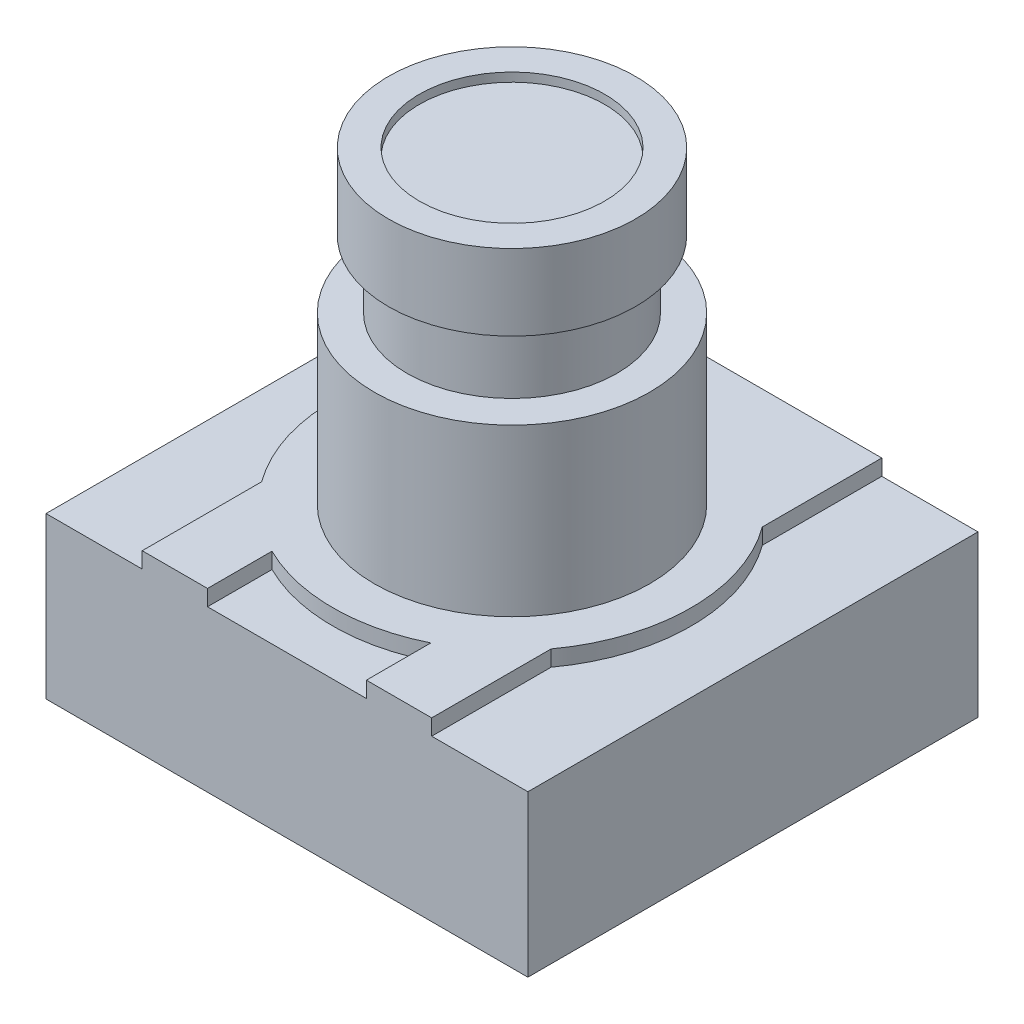
ISO-10303-21;
HEADER;
FILE_DESCRIPTION(('STEP AP214'),'2;1');
FILE_NAME('part.step','',(''),(''),'','','');
FILE_SCHEMA(('AUTOMOTIVE_DESIGN { 1 0 10303 214 1 1 1 1 }'));
ENDSEC;
DATA;
#1=APPLICATION_CONTEXT('core data for automotive mechanical design processes');
#2=APPLICATION_PROTOCOL_DEFINITION('international standard','automotive_design',2000,#1);
#3=PRODUCT_CONTEXT('',#1,'mechanical');
#4=PRODUCT('Part','Part','',(#3));
#5=PRODUCT_RELATED_PRODUCT_CATEGORY('part','',(#4));
#6=PRODUCT_DEFINITION_FORMATION('','',#4);
#7=PRODUCT_DEFINITION_CONTEXT('part definition',#1,'design');
#8=PRODUCT_DEFINITION('design','',#6,#7);
#9=PRODUCT_DEFINITION_SHAPE('','',#8);
#10=(LENGTH_UNIT() NAMED_UNIT(*) SI_UNIT(.MILLI.,.METRE.));
#11=(NAMED_UNIT(*) PLANE_ANGLE_UNIT() SI_UNIT($,.RADIAN.));
#12=(NAMED_UNIT(*) SI_UNIT($,.STERADIAN.) SOLID_ANGLE_UNIT());
#13=UNCERTAINTY_MEASURE_WITH_UNIT(LENGTH_MEASURE(1.E-05),#10,'distance_accuracy_value','');
#14=(GEOMETRIC_REPRESENTATION_CONTEXT(3) GLOBAL_UNCERTAINTY_ASSIGNED_CONTEXT((#13)) GLOBAL_UNIT_ASSIGNED_CONTEXT((#10,
#11,#12)) REPRESENTATION_CONTEXT('',''));
#15=CARTESIAN_POINT('',(0.,0.,0.));
#16=DIRECTION('',(0.,0.,1.));
#17=DIRECTION('',(1.,0.,0.));
#18=AXIS2_PLACEMENT_3D('',#15,#16,#17);
#19=CARTESIAN_POINT('',(-3.45,-1.1,8.05));
#20=DIRECTION('',(0.,0.,1.));
#21=DIRECTION('',(1.,0.,0.));
#22=AXIS2_PLACEMENT_3D('',#19,#20,#21);
#23=PLANE('',#22);
#24=DIRECTION('',(1.,0.,0.));
#25=VECTOR('',#24,1.);
#26=CARTESIAN_POINT('',(-3.45,0.,8.05));
#27=LINE('',#26,#25);
#28=CARTESIAN_POINT('',(-3.45,0.,8.05));
#29=VERTEX_POINT('',#28);
#30=CARTESIAN_POINT('',(-2.95,0.,8.05));
#31=VERTEX_POINT('',#30);
#32=EDGE_CURVE('E252',#29,#31,#27,.T.);
#33=ORIENTED_EDGE('',*,*,#32,.T.);
#34=DIRECTION('',(0.,-1.,0.));
#35=VECTOR('',#34,1.);
#36=CARTESIAN_POINT('',(-2.95,1.4,8.05));
#37=LINE('',#36,#35);
#38=CARTESIAN_POINT('',(-2.95,-1.1,8.05));
#39=VERTEX_POINT('',#38);
#40=EDGE_CURVE('E213',#31,#39,#37,.T.);
#41=ORIENTED_EDGE('',*,*,#40,.T.);
#42=DIRECTION('',(1.,0.,0.));
#43=VECTOR('',#42,1.);
#44=CARTESIAN_POINT('',(-3.45,-1.1,8.05));
#45=LINE('',#44,#43);
#46=CARTESIAN_POINT('',(-3.45,-1.1,8.05));
#47=VERTEX_POINT('',#46);
#48=EDGE_CURVE('E257',#47,#39,#45,.T.);
#49=ORIENTED_EDGE('',*,*,#48,.F.);
#50=DIRECTION('',(0.,1.,0.));
#51=VECTOR('',#50,1.);
#52=CARTESIAN_POINT('',(-3.45,-1.1,8.05));
#53=LINE('',#52,#51);
#54=EDGE_CURVE('E272',#47,#29,#53,.T.);
#55=ORIENTED_EDGE('',*,*,#54,.T.);
#56=EDGE_LOOP('',(#33,#41,#49,#55));
#57=FACE_BOUND('',#56,.T.);
#58=ADVANCED_FACE('F37',(#57),#23,.F.);
#59=CARTESIAN_POINT('',(0.,0.,0.));
#60=DIRECTION('',(0.,1.,0.));
#61=DIRECTION('',(0.,0.,1.));
#62=AXIS2_PLACEMENT_3D('',#59,#60,#61);
#63=PLANE('',#62);
#64=DIRECTION('',(0.,0.,-1.));
#65=VECTOR('',#64,1.);
#66=CARTESIAN_POINT('',(13.65,0.,-12.75));
#67=LINE('',#66,#65);
#68=CARTESIAN_POINT('',(13.65,0.,12.75));
#69=VERTEX_POINT('',#68);
#70=CARTESIAN_POINT('',(13.65,0.,-12.75));
#71=VERTEX_POINT('',#70);
#72=EDGE_CURVE('E382',#69,#71,#67,.T.);
#73=ORIENTED_EDGE('',*,*,#72,.F.);
#74=DIRECTION('',(1.,0.,0.));
#75=VECTOR('',#74,1.);
#76=CARTESIAN_POINT('',(-13.65,0.,12.75));
#77=LINE('',#76,#75);
#78=CARTESIAN_POINT('',(-13.65,0.,12.75));
#79=VERTEX_POINT('',#78);
#80=EDGE_CURVE('E394',#79,#69,#77,.T.);
#81=ORIENTED_EDGE('',*,*,#80,.F.);
#82=DIRECTION('',(0.,0.,1.));
#83=VECTOR('',#82,1.);
#84=CARTESIAN_POINT('',(-13.65,0.,-12.75));
#85=LINE('',#84,#83);
#86=CARTESIAN_POINT('',(-13.65,0.,-12.75));
#87=VERTEX_POINT('',#86);
#88=EDGE_CURVE('E404',#87,#79,#85,.T.);
#89=ORIENTED_EDGE('',*,*,#88,.F.);
#90=DIRECTION('',(-1.,0.,0.));
#91=VECTOR('',#90,1.);
#92=CARTESIAN_POINT('',(-13.65,0.,-12.75));
#93=LINE('',#92,#91);
#94=EDGE_CURVE('E401',#71,#87,#93,.T.);
#95=ORIENTED_EDGE('',*,*,#94,.F.);
#96=EDGE_LOOP('',(#73,#81,#89,#95));
#97=FACE_BOUND('',#96,.T.);
#98=DIRECTION('',(0.,0.,1.));
#99=VECTOR('',#98,1.);
#100=CARTESIAN_POINT('',(3.45,0.,11.25));
#101=LINE('',#100,#99);
#102=CARTESIAN_POINT('',(3.45,0.,8.05));
#103=VERTEX_POINT('',#102);
#104=CARTESIAN_POINT('',(3.45,0.,11.25));
#105=VERTEX_POINT('',#104);
#106=EDGE_CURVE('E247',#103,#105,#101,.T.);
#107=ORIENTED_EDGE('',*,*,#106,.F.);
#108=CARTESIAN_POINT('',(2.95,0.,8.05));
#109=VERTEX_POINT('',#108);
#110=EDGE_CURVE('E267',#109,#103,#27,.T.);
#111=ORIENTED_EDGE('',*,*,#110,.F.);
#112=DIRECTION('',(-1.,0.,0.));
#113=VECTOR('',#112,1.);
#114=CARTESIAN_POINT('',(0.,0.,8.05));
#115=LINE('',#114,#113);
#116=EDGE_CURVE('E242',#109,#31,#115,.T.);
#117=ORIENTED_EDGE('',*,*,#116,.T.);
#118=ORIENTED_EDGE('',*,*,#32,.F.);
#119=DIRECTION('',(0.,0.,-1.));
#120=VECTOR('',#119,1.);
#121=CARTESIAN_POINT('',(-3.45,0.,11.25));
#122=LINE('',#121,#120);
#123=CARTESIAN_POINT('',(-3.45,0.,11.25));
#124=VERTEX_POINT('',#123);
#125=EDGE_CURVE('E264',#124,#29,#122,.T.);
#126=ORIENTED_EDGE('',*,*,#125,.F.);
#127=DIRECTION('',(-1.,0.,0.));
#128=VECTOR('',#127,1.);
#129=CARTESIAN_POINT('',(-3.45,0.,11.25));
#130=LINE('',#129,#128);
#131=EDGE_CURVE('E60',#105,#124,#130,.T.);
#132=ORIENTED_EDGE('',*,*,#131,.F.);
#133=EDGE_LOOP('',(#107,#111,#117,#118,#126,#132));
#134=FACE_BOUND('',#133,.T.);
#135=ADVANCED_FACE('F427',(#97,#134),#63,.F.);
#136=CARTESIAN_POINT('',(0.,19.4,0.));
#137=DIRECTION('',(0.,1.,0.));
#138=DIRECTION('',(0.,0.,1.));
#139=AXIS2_PLACEMENT_3D('',#136,#137,#138);
#140=PLANE('',#139);
#141=CARTESIAN_POINT('',(0.,19.4,0.));
#142=DIRECTION('',(0.,1.,0.));
#143=DIRECTION('',(0.,0.,1.));
#144=AXIS2_PLACEMENT_3D('',#141,#142,#143);
#145=CIRCLE('',#144,7.8);
#146=CARTESIAN_POINT('',(0.,19.4,7.8));
#147=VERTEX_POINT('',#146);
#148=EDGE_CURVE('E299',#147,#147,#145,.T.);
#149=ORIENTED_EDGE('',*,*,#148,.T.);
#150=EDGE_LOOP('',(#149));
#151=FACE_BOUND('',#150,.T.);
#152=CARTESIAN_POINT('',(0.,19.4,0.));
#153=DIRECTION('',(0.,1.,0.));
#154=DIRECTION('',(0.,0.,1.));
#155=AXIS2_PLACEMENT_3D('',#152,#153,#154);
#156=CIRCLE('',#155,5.95);
#157=CARTESIAN_POINT('',(0.,19.4,-5.95));
#158=VERTEX_POINT('',#157);
#159=EDGE_CURVE('E292',#158,#158,#156,.T.);
#160=ORIENTED_EDGE('',*,*,#159,.F.);
#161=EDGE_LOOP('',(#160));
#162=FACE_BOUND('',#161,.T.);
#163=ADVANCED_FACE('F502',(#151,#162),#140,.T.);
#164=CARTESIAN_POINT('',(0.,10.,0.));
#165=DIRECTION('',(0.,1.,0.));
#166=DIRECTION('',(0.,0.,1.));
#167=AXIS2_PLACEMENT_3D('',#164,#165,#166);
#168=PLANE('',#167);
#169=DIRECTION('',(0.,0.,1.));
#170=VECTOR('',#169,1.);
#171=CARTESIAN_POINT('',(-4.5,10.,0.));
#172=LINE('',#171,#170);
#173=CARTESIAN_POINT('',(-4.5,10.,9.09793932712238));
#174=VERTEX_POINT('',#173);
#175=CARTESIAN_POINT('',(-4.5,10.,12.75));
#176=VERTEX_POINT('',#175);
#177=EDGE_CURVE('E309',#174,#176,#172,.T.);
#178=ORIENTED_EDGE('',*,*,#177,.F.);
#179=CARTESIAN_POINT('',(0.,10.,0.));
#180=DIRECTION('',(0.,1.,0.));
#181=DIRECTION('',(0.,0.,1.));
#182=AXIS2_PLACEMENT_3D('',#179,#180,#181);
#183=CIRCLE('',#182,10.15);
#184=CARTESIAN_POINT('',(4.49999999999999,10.,9.09793932712238));
#185=VERTEX_POINT('',#184);
#186=EDGE_CURVE('E319',#174,#185,#183,.T.);
#187=ORIENTED_EDGE('',*,*,#186,.T.);
#188=DIRECTION('',(0.,0.,1.));
#189=VECTOR('',#188,1.);
#190=CARTESIAN_POINT('',(4.5,10.,0.));
#191=LINE('',#190,#189);
#192=CARTESIAN_POINT('',(4.49999999999998,10.,12.75));
#193=VERTEX_POINT('',#192);
#194=EDGE_CURVE('E302',#185,#193,#191,.T.);
#195=ORIENTED_EDGE('',*,*,#194,.T.);
#196=DIRECTION('',(1.,0.,0.));
#197=VECTOR('',#196,1.);
#198=CARTESIAN_POINT('',(-13.65,10.,12.75));
#199=LINE('',#198,#197);
#200=CARTESIAN_POINT('',(8.19999999999999,10.,12.75));
#201=VERTEX_POINT('',#200);
#202=EDGE_CURVE('E393',#193,#201,#199,.T.);
#203=ORIENTED_EDGE('',*,*,#202,.T.);
#204=DIRECTION('',(0.,0.,1.));
#205=VECTOR('',#204,1.);
#206=CARTESIAN_POINT('',(8.19999999999999,10.,0.));
#207=LINE('',#206,#205);
#208=CARTESIAN_POINT('',(8.19999999999999,10.,5.98184754068509));
#209=VERTEX_POINT('',#208);
#210=EDGE_CURVE('E347',#209,#201,#207,.T.);
#211=ORIENTED_EDGE('',*,*,#210,.F.);
#212=CARTESIAN_POINT('',(0.,10.,0.));
#213=DIRECTION('',(0.,1.,0.));
#214=DIRECTION('',(0.,0.,1.));
#215=AXIS2_PLACEMENT_3D('',#212,#213,#214);
#216=CIRCLE('',#215,10.15);
#217=CARTESIAN_POINT('',(8.19999999999999,10.,-5.98184754068508));
#218=VERTEX_POINT('',#217);
#219=EDGE_CURVE('E326',#209,#218,#216,.T.);
#220=ORIENTED_EDGE('',*,*,#219,.T.);
#221=CARTESIAN_POINT('',(8.19999999999999,10.,-12.75));
#222=VERTEX_POINT('',#221);
#223=EDGE_CURVE('E335',#222,#218,#207,.T.);
#224=ORIENTED_EDGE('',*,*,#223,.F.);
#225=DIRECTION('',(-1.,0.,0.));
#226=VECTOR('',#225,1.);
#227=CARTESIAN_POINT('',(-13.65,10.,-12.75));
#228=LINE('',#227,#226);
#229=CARTESIAN_POINT('',(-8.2,10.,-12.75));
#230=VERTEX_POINT('',#229);
#231=EDGE_CURVE('E391',#222,#230,#228,.T.);
#232=ORIENTED_EDGE('',*,*,#231,.T.);
#233=DIRECTION('',(0.,0.,1.));
#234=VECTOR('',#233,1.);
#235=CARTESIAN_POINT('',(-8.2,10.,0.));
#236=LINE('',#235,#234);
#237=CARTESIAN_POINT('',(-8.2,10.,-5.98184754068507));
#238=VERTEX_POINT('',#237);
#239=EDGE_CURVE('E376',#230,#238,#236,.T.);
#240=ORIENTED_EDGE('',*,*,#239,.T.);
#241=CARTESIAN_POINT('',(0.,10.,0.));
#242=DIRECTION('',(0.,1.,0.));
#243=DIRECTION('',(0.,0.,1.));
#244=AXIS2_PLACEMENT_3D('',#241,#242,#243);
#245=CIRCLE('',#244,10.15);
#246=CARTESIAN_POINT('',(-8.2,10.,5.98184754068508));
#247=VERTEX_POINT('',#246);
#248=EDGE_CURVE('E352',#238,#247,#245,.T.);
#249=ORIENTED_EDGE('',*,*,#248,.T.);
#250=CARTESIAN_POINT('',(-8.2,10.,12.75));
#251=VERTEX_POINT('',#250);
#252=EDGE_CURVE('E364',#247,#251,#236,.T.);
#253=ORIENTED_EDGE('',*,*,#252,.T.);
#254=EDGE_CURVE('E395',#251,#176,#199,.T.);
#255=ORIENTED_EDGE('',*,*,#254,.T.);
#256=EDGE_LOOP('',(#178,#187,#195,#203,#211,#220,#224,#232,#240,#249,#253,#255));
#257=FACE_BOUND('',#256,.T.);
#258=CARTESIAN_POINT('',(0.,10.,0.));
#259=DIRECTION('',(0.,1.,0.));
#260=DIRECTION('',(0.,0.,1.));
#261=AXIS2_PLACEMENT_3D('',#258,#259,#260);
#262=CIRCLE('',#261,7.8);
#263=CARTESIAN_POINT('',(0.,10.,7.8));
#264=VERTEX_POINT('',#263);
#265=EDGE_CURVE('E296',#264,#264,#262,.T.);
#266=ORIENTED_EDGE('',*,*,#265,.F.);
#267=EDGE_LOOP('',(#266));
#268=FACE_BOUND('',#267,.T.);
#269=ADVANCED_FACE('F447',(#257,#268),#168,.T.);
#270=CARTESIAN_POINT('',(13.65,10.,-12.75));
#271=DIRECTION('',(-1.,0.,0.));
#272=DIRECTION('',(0.,0.,1.));
#273=AXIS2_PLACEMENT_3D('',#270,#271,#272);
#274=PLANE('',#273);
#275=DIRECTION('',(0.,0.,-1.));
#276=VECTOR('',#275,1.);
#277=CARTESIAN_POINT('',(13.65,9.1,0.));
#278=LINE('',#277,#276);
#279=CARTESIAN_POINT('',(13.65,9.1,12.75));
#280=VERTEX_POINT('',#279);
#281=CARTESIAN_POINT('',(13.65,9.1,-12.75));
#282=VERTEX_POINT('',#281);
#283=EDGE_CURVE('E341',#280,#282,#278,.T.);
#284=ORIENTED_EDGE('',*,*,#283,.F.);
#285=DIRECTION('',(0.,-1.,0.));
#286=VECTOR('',#285,1.);
#287=CARTESIAN_POINT('',(13.65,10.,12.75));
#288=LINE('',#287,#286);
#289=EDGE_CURVE('E398',#280,#69,#288,.T.);
#290=ORIENTED_EDGE('',*,*,#289,.T.);
#291=ORIENTED_EDGE('',*,*,#72,.T.);
#292=DIRECTION('',(0.,-1.,0.));
#293=VECTOR('',#292,1.);
#294=CARTESIAN_POINT('',(13.65,10.,-12.75));
#295=LINE('',#294,#293);
#296=EDGE_CURVE('E12',#282,#71,#295,.T.);
#297=ORIENTED_EDGE('',*,*,#296,.F.);
#298=EDGE_LOOP('',(#284,#290,#291,#297));
#299=FACE_BOUND('',#298,.T.);
#300=ADVANCED_FACE('F39',(#299),#274,.F.);
#301=CARTESIAN_POINT('',(-13.65,10.,-12.75));
#302=DIRECTION('',(0.,0.,1.));
#303=DIRECTION('',(1.,0.,0.));
#304=AXIS2_PLACEMENT_3D('',#301,#302,#303);
#305=PLANE('',#304);
#306=ORIENTED_EDGE('',*,*,#231,.F.);
#307=DIRECTION('',(0.,1.,0.));
#308=VECTOR('',#307,1.);
#309=CARTESIAN_POINT('',(8.19999999999999,9.1,-12.75));
#310=LINE('',#309,#308);
#311=CARTESIAN_POINT('',(8.19999999999999,9.1,-12.75));
#312=VERTEX_POINT('',#311);
#313=EDGE_CURVE('E353',#312,#222,#310,.T.);
#314=ORIENTED_EDGE('',*,*,#313,.F.);
#315=DIRECTION('',(-1.,0.,0.));
#316=VECTOR('',#315,1.);
#317=CARTESIAN_POINT('',(0.,9.1,-12.75));
#318=LINE('',#317,#316);
#319=EDGE_CURVE('E343',#282,#312,#318,.T.);
#320=ORIENTED_EDGE('',*,*,#319,.F.);
#321=ORIENTED_EDGE('',*,*,#296,.T.);
#322=ORIENTED_EDGE('',*,*,#94,.T.);
#323=DIRECTION('',(0.,-1.,0.));
#324=VECTOR('',#323,1.);
#325=CARTESIAN_POINT('',(-13.65,10.,-12.75));
#326=LINE('',#325,#324);
#327=CARTESIAN_POINT('',(-13.65,9.1,-12.75));
#328=VERTEX_POINT('',#327);
#329=EDGE_CURVE('E45',#328,#87,#326,.T.);
#330=ORIENTED_EDGE('',*,*,#329,.F.);
#331=DIRECTION('',(-1.,0.,0.));
#332=VECTOR('',#331,1.);
#333=CARTESIAN_POINT('',(0.,9.1,-12.75));
#334=LINE('',#333,#332);
#335=CARTESIAN_POINT('',(-8.2,9.1,-12.75));
#336=VERTEX_POINT('',#335);
#337=EDGE_CURVE('E366',#336,#328,#334,.T.);
#338=ORIENTED_EDGE('',*,*,#337,.F.);
#339=DIRECTION('',(0.,1.,0.));
#340=VECTOR('',#339,1.);
#341=CARTESIAN_POINT('',(-8.2,9.1,-12.75));
#342=LINE('',#341,#340);
#343=EDGE_CURVE('E385',#336,#230,#342,.T.);
#344=ORIENTED_EDGE('',*,*,#343,.T.);
#345=EDGE_LOOP('',(#306,#314,#320,#321,#322,#330,#338,#344));
#346=FACE_BOUND('',#345,.T.);
#347=ADVANCED_FACE('F422',(#346),#305,.F.);
#348=CARTESIAN_POINT('',(-13.65,10.,-12.75));
#349=DIRECTION('',(1.,0.,0.));
#350=DIRECTION('',(0.,0.,-1.));
#351=AXIS2_PLACEMENT_3D('',#348,#349,#350);
#352=PLANE('',#351);
#353=DIRECTION('',(0.,0.,1.));
#354=VECTOR('',#353,1.);
#355=CARTESIAN_POINT('',(-13.65,9.1,0.));
#356=LINE('',#355,#354);
#357=CARTESIAN_POINT('',(-13.65,9.1,12.75));
#358=VERTEX_POINT('',#357);
#359=EDGE_CURVE('E369',#328,#358,#356,.T.);
#360=ORIENTED_EDGE('',*,*,#359,.F.);
#361=ORIENTED_EDGE('',*,*,#329,.T.);
#362=ORIENTED_EDGE('',*,*,#88,.T.);
#363=DIRECTION('',(0.,-1.,0.));
#364=VECTOR('',#363,1.);
#365=CARTESIAN_POINT('',(-13.65,10.,12.75));
#366=LINE('',#365,#364);
#367=EDGE_CURVE('E410',#358,#79,#366,.T.);
#368=ORIENTED_EDGE('',*,*,#367,.F.);
#369=EDGE_LOOP('',(#360,#361,#362,#368));
#370=FACE_BOUND('',#369,.T.);
#371=ADVANCED_FACE('F414',(#370),#352,.F.);
#372=CARTESIAN_POINT('',(-13.65,10.,12.75));
#373=DIRECTION('',(0.,0.,-1.));
#374=DIRECTION('',(-1.,0.,0.));
#375=AXIS2_PLACEMENT_3D('',#372,#373,#374);
#376=PLANE('',#375);
#377=DIRECTION('',(1.,0.,0.));
#378=VECTOR('',#377,1.);
#379=CARTESIAN_POINT('',(0.,9.1,12.75));
#380=LINE('',#379,#378);
#381=CARTESIAN_POINT('',(-4.5,9.1,12.75));
#382=VERTEX_POINT('',#381);
#383=CARTESIAN_POINT('',(4.49999999999999,9.1,12.75));
#384=VERTEX_POINT('',#383);
#385=EDGE_CURVE('E305',#382,#384,#380,.T.);
#386=ORIENTED_EDGE('',*,*,#385,.F.);
#387=DIRECTION('',(0.,1.,0.));
#388=VECTOR('',#387,1.);
#389=CARTESIAN_POINT('',(-4.5,9.1,12.75));
#390=LINE('',#389,#388);
#391=EDGE_CURVE('E323',#382,#176,#390,.T.);
#392=ORIENTED_EDGE('',*,*,#391,.T.);
#393=ORIENTED_EDGE('',*,*,#254,.F.);
#394=DIRECTION('',(0.,1.,0.));
#395=VECTOR('',#394,1.);
#396=CARTESIAN_POINT('',(-8.2,9.1,12.75));
#397=LINE('',#396,#395);
#398=CARTESIAN_POINT('',(-8.2,9.1,12.75));
#399=VERTEX_POINT('',#398);
#400=EDGE_CURVE('E383',#399,#251,#397,.T.);
#401=ORIENTED_EDGE('',*,*,#400,.F.);
#402=DIRECTION('',(1.,0.,0.));
#403=VECTOR('',#402,1.);
#404=CARTESIAN_POINT('',(0.,9.1,12.75));
#405=LINE('',#404,#403);
#406=EDGE_CURVE('E371',#358,#399,#405,.T.);
#407=ORIENTED_EDGE('',*,*,#406,.F.);
#408=ORIENTED_EDGE('',*,*,#367,.T.);
#409=ORIENTED_EDGE('',*,*,#80,.T.);
#410=ORIENTED_EDGE('',*,*,#289,.F.);
#411=DIRECTION('',(1.,0.,0.));
#412=VECTOR('',#411,1.);
#413=CARTESIAN_POINT('',(0.,9.1,12.75));
#414=LINE('',#413,#412);
#415=CARTESIAN_POINT('',(8.19999999999999,9.1,12.75));
#416=VERTEX_POINT('',#415);
#417=EDGE_CURVE('E338',#416,#280,#414,.T.);
#418=ORIENTED_EDGE('',*,*,#417,.F.);
#419=DIRECTION('',(0.,1.,0.));
#420=VECTOR('',#419,1.);
#421=CARTESIAN_POINT('',(8.19999999999999,9.1,12.75));
#422=LINE('',#421,#420);
#423=EDGE_CURVE('E355',#416,#201,#422,.T.);
#424=ORIENTED_EDGE('',*,*,#423,.T.);
#425=ORIENTED_EDGE('',*,*,#202,.F.);
#426=DIRECTION('',(0.,1.,0.));
#427=VECTOR('',#426,1.);
#428=CARTESIAN_POINT('',(4.49999999999999,9.1,12.75));
#429=LINE('',#428,#427);
#430=EDGE_CURVE('E316',#384,#193,#429,.T.);
#431=ORIENTED_EDGE('',*,*,#430,.F.);
#432=EDGE_LOOP('',(#386,#392,#393,#401,#407,#408,#409,#410,#418,#424,#425,#431));
#433=FACE_BOUND('',#432,.T.);
#434=ADVANCED_FACE('F431',(#433),#376,.F.);
#435=CARTESIAN_POINT('',(0.,9.1,0.));
#436=DIRECTION('',(0.,1.,0.));
#437=DIRECTION('',(0.,0.,1.));
#438=AXIS2_PLACEMENT_3D('',#435,#436,#437);
#439=CYLINDRICAL_SURFACE('',#438,10.15);
#440=ORIENTED_EDGE('',*,*,#248,.F.);
#441=DIRECTION('',(0.,1.,0.));
#442=VECTOR('',#441,1.);
#443=CARTESIAN_POINT('',(-8.2,9.1,-5.98184754068507));
#444=LINE('',#443,#442);
#445=CARTESIAN_POINT('',(-8.2,9.1,-5.98184754068507));
#446=VERTEX_POINT('',#445);
#447=EDGE_CURVE('E388',#446,#238,#444,.T.);
#448=ORIENTED_EDGE('',*,*,#447,.F.);
#449=CARTESIAN_POINT('',(0.,9.1,0.));
#450=DIRECTION('',(0.,1.,0.));
#451=DIRECTION('',(0.,0.,1.));
#452=AXIS2_PLACEMENT_3D('',#449,#450,#451);
#453=CIRCLE('',#452,10.15);
#454=CARTESIAN_POINT('',(-8.2,9.1,5.98184754068508));
#455=VERTEX_POINT('',#454);
#456=EDGE_CURVE('E360',#446,#455,#453,.T.);
#457=ORIENTED_EDGE('',*,*,#456,.T.);
#458=DIRECTION('',(0.,1.,0.));
#459=VECTOR('',#458,1.);
#460=CARTESIAN_POINT('',(-8.2,9.1,5.98184754068508));
#461=LINE('',#460,#459);
#462=EDGE_CURVE('E379',#455,#247,#461,.T.);
#463=ORIENTED_EDGE('',*,*,#462,.T.);
#464=EDGE_LOOP('',(#440,#448,#457,#463));
#465=FACE_BOUND('',#464,.T.);
#466=ADVANCED_FACE('F485',(#465),#439,.T.);
#467=CARTESIAN_POINT('',(-8.2,9.1,0.));
#468=DIRECTION('',(-1.,0.,0.));
#469=DIRECTION('',(0.,0.,1.));
#470=AXIS2_PLACEMENT_3D('',#467,#468,#469);
#471=PLANE('',#470);
#472=ORIENTED_EDGE('',*,*,#252,.F.);
#473=ORIENTED_EDGE('',*,*,#462,.F.);
#474=DIRECTION('',(0.,0.,1.));
#475=VECTOR('',#474,1.);
#476=CARTESIAN_POINT('',(-8.2,9.1,0.));
#477=LINE('',#476,#475);
#478=EDGE_CURVE('E367',#455,#399,#477,.T.);
#479=ORIENTED_EDGE('',*,*,#478,.T.);
#480=ORIENTED_EDGE('',*,*,#400,.T.);
#481=EDGE_LOOP('',(#472,#473,#479,#480));
#482=FACE_BOUND('',#481,.T.);
#483=ADVANCED_FACE('F483',(#482),#471,.T.);
#484=ORIENTED_EDGE('',*,*,#239,.F.);
#485=ORIENTED_EDGE('',*,*,#343,.F.);
#486=EDGE_CURVE('E363',#336,#446,#477,.T.);
#487=ORIENTED_EDGE('',*,*,#486,.T.);
#488=ORIENTED_EDGE('',*,*,#447,.T.);
#489=EDGE_LOOP('',(#484,#485,#487,#488));
#490=FACE_BOUND('',#489,.T.);
#491=ADVANCED_FACE('F443',(#490),#471,.T.);
#492=CARTESIAN_POINT('',(0.,9.1,0.));
#493=DIRECTION('',(0.,1.,0.));
#494=DIRECTION('',(0.,0.,1.));
#495=AXIS2_PLACEMENT_3D('',#492,#493,#494);
#496=PLANE('',#495);
#497=ORIENTED_EDGE('',*,*,#456,.F.);
#498=ORIENTED_EDGE('',*,*,#486,.F.);
#499=ORIENTED_EDGE('',*,*,#337,.T.);
#500=ORIENTED_EDGE('',*,*,#359,.T.);
#501=ORIENTED_EDGE('',*,*,#406,.T.);
#502=ORIENTED_EDGE('',*,*,#478,.F.);
#503=EDGE_LOOP('',(#497,#498,#499,#500,#501,#502));
#504=FACE_BOUND('',#503,.T.);
#505=ADVANCED_FACE('F438',(#504),#496,.T.);
#506=CARTESIAN_POINT('',(0.,9.1,0.));
#507=DIRECTION('',(0.,1.,0.));
#508=DIRECTION('',(0.,0.,1.));
#509=AXIS2_PLACEMENT_3D('',#506,#507,#508);
#510=CYLINDRICAL_SURFACE('',#509,10.15);
#511=ORIENTED_EDGE('',*,*,#219,.F.);
#512=DIRECTION('',(0.,1.,0.));
#513=VECTOR('',#512,1.);
#514=CARTESIAN_POINT('',(8.19999999999999,9.1,5.98184754068509));
#515=LINE('',#514,#513);
#516=CARTESIAN_POINT('',(8.19999999999999,9.1,5.98184754068509));
#517=VERTEX_POINT('',#516);
#518=EDGE_CURVE('E358',#517,#209,#515,.T.);
#519=ORIENTED_EDGE('',*,*,#518,.F.);
#520=CARTESIAN_POINT('',(0.,9.1,0.));
#521=DIRECTION('',(0.,1.,0.));
#522=DIRECTION('',(0.,0.,1.));
#523=AXIS2_PLACEMENT_3D('',#520,#521,#522);
#524=CIRCLE('',#523,10.15);
#525=CARTESIAN_POINT('',(8.19999999999999,9.1,-5.98184754068508));
#526=VERTEX_POINT('',#525);
#527=EDGE_CURVE('E332',#517,#526,#524,.T.);
#528=ORIENTED_EDGE('',*,*,#527,.T.);
#529=DIRECTION('',(0.,1.,0.));
#530=VECTOR('',#529,1.);
#531=CARTESIAN_POINT('',(8.19999999999999,9.1,-5.98184754068508));
#532=LINE('',#531,#530);
#533=EDGE_CURVE('E350',#526,#218,#532,.T.);
#534=ORIENTED_EDGE('',*,*,#533,.T.);
#535=EDGE_LOOP('',(#511,#519,#528,#534));
#536=FACE_BOUND('',#535,.T.);
#537=ADVANCED_FACE('F586',(#536),#510,.T.);
#538=CARTESIAN_POINT('',(8.19999999999999,9.1,0.));
#539=DIRECTION('',(-1.,0.,0.));
#540=DIRECTION('',(0.,0.,1.));
#541=AXIS2_PLACEMENT_3D('',#538,#539,#540);
#542=PLANE('',#541);
#543=ORIENTED_EDGE('',*,*,#223,.T.);
#544=ORIENTED_EDGE('',*,*,#533,.F.);
#545=DIRECTION('',(0.,0.,1.));
#546=VECTOR('',#545,1.);
#547=CARTESIAN_POINT('',(8.19999999999999,9.1,0.));
#548=LINE('',#547,#546);
#549=EDGE_CURVE('E339',#312,#526,#548,.T.);
#550=ORIENTED_EDGE('',*,*,#549,.F.);
#551=ORIENTED_EDGE('',*,*,#313,.T.);
#552=EDGE_LOOP('',(#543,#544,#550,#551));
#553=FACE_BOUND('',#552,.T.);
#554=ADVANCED_FACE('F456',(#553),#542,.F.);
#555=ORIENTED_EDGE('',*,*,#210,.T.);
#556=ORIENTED_EDGE('',*,*,#423,.F.);
#557=EDGE_CURVE('E334',#517,#416,#548,.T.);
#558=ORIENTED_EDGE('',*,*,#557,.F.);
#559=ORIENTED_EDGE('',*,*,#518,.T.);
#560=EDGE_LOOP('',(#555,#556,#558,#559));
#561=FACE_BOUND('',#560,.T.);
#562=ADVANCED_FACE('F468',(#561),#542,.F.);
#563=CARTESIAN_POINT('',(0.,9.1,0.));
#564=DIRECTION('',(0.,1.,0.));
#565=DIRECTION('',(0.,0.,1.));
#566=AXIS2_PLACEMENT_3D('',#563,#564,#565);
#567=PLANE('',#566);
#568=ORIENTED_EDGE('',*,*,#527,.F.);
#569=ORIENTED_EDGE('',*,*,#557,.T.);
#570=ORIENTED_EDGE('',*,*,#417,.T.);
#571=ORIENTED_EDGE('',*,*,#283,.T.);
#572=ORIENTED_EDGE('',*,*,#319,.T.);
#573=ORIENTED_EDGE('',*,*,#549,.T.);
#574=EDGE_LOOP('',(#568,#569,#570,#571,#572,#573));
#575=FACE_BOUND('',#574,.T.);
#576=ADVANCED_FACE('F463',(#575),#567,.T.);
#577=CARTESIAN_POINT('',(-4.5,9.1,0.));
#578=DIRECTION('',(-1.,0.,0.));
#579=DIRECTION('',(0.,0.,1.));
#580=AXIS2_PLACEMENT_3D('',#577,#578,#579);
#581=PLANE('',#580);
#582=ORIENTED_EDGE('',*,*,#177,.T.);
#583=ORIENTED_EDGE('',*,*,#391,.F.);
#584=DIRECTION('',(0.,0.,1.));
#585=VECTOR('',#584,1.);
#586=CARTESIAN_POINT('',(-4.5,9.1,0.));
#587=LINE('',#586,#585);
#588=CARTESIAN_POINT('',(-4.5,9.1,9.09793932712238));
#589=VERTEX_POINT('',#588);
#590=EDGE_CURVE('E313',#589,#382,#587,.T.);
#591=ORIENTED_EDGE('',*,*,#590,.F.);
#592=DIRECTION('',(0.,1.,0.));
#593=VECTOR('',#592,1.);
#594=CARTESIAN_POINT('',(-4.5,9.1,9.09793932712238));
#595=LINE('',#594,#593);
#596=EDGE_CURVE('E327',#589,#174,#595,.T.);
#597=ORIENTED_EDGE('',*,*,#596,.T.);
#598=EDGE_LOOP('',(#582,#583,#591,#597));
#599=FACE_BOUND('',#598,.T.);
#600=ADVANCED_FACE('F480',(#599),#581,.F.);
#601=CARTESIAN_POINT('',(0.,9.1,0.));
#602=DIRECTION('',(0.,1.,0.));
#603=DIRECTION('',(0.,0.,1.));
#604=AXIS2_PLACEMENT_3D('',#601,#602,#603);
#605=CYLINDRICAL_SURFACE('',#604,10.15);
#606=ORIENTED_EDGE('',*,*,#186,.F.);
#607=ORIENTED_EDGE('',*,*,#596,.F.);
#608=CARTESIAN_POINT('',(0.,9.1,0.));
#609=DIRECTION('',(0.,1.,0.));
#610=DIRECTION('',(0.,0.,1.));
#611=AXIS2_PLACEMENT_3D('',#608,#609,#610);
#612=CIRCLE('',#611,10.15);
#613=CARTESIAN_POINT('',(4.49999999999999,9.1,9.09793932712238));
#614=VERTEX_POINT('',#613);
#615=EDGE_CURVE('E311',#589,#614,#612,.T.);
#616=ORIENTED_EDGE('',*,*,#615,.T.);
#617=DIRECTION('',(0.,1.,0.));
#618=VECTOR('',#617,1.);
#619=CARTESIAN_POINT('',(4.49999999999999,9.1,9.09793932712238));
#620=LINE('',#619,#618);
#621=EDGE_CURVE('E329',#614,#185,#620,.T.);
#622=ORIENTED_EDGE('',*,*,#621,.T.);
#623=EDGE_LOOP('',(#606,#607,#616,#622));
#624=FACE_BOUND('',#623,.T.);
#625=ADVANCED_FACE('F576',(#624),#605,.T.);
#626=CARTESIAN_POINT('',(4.5,9.1,0.));
#627=DIRECTION('',(-1.,0.,0.));
#628=DIRECTION('',(0.,0.,1.));
#629=AXIS2_PLACEMENT_3D('',#626,#627,#628);
#630=PLANE('',#629);
#631=ORIENTED_EDGE('',*,*,#194,.F.);
#632=ORIENTED_EDGE('',*,*,#621,.F.);
#633=DIRECTION('',(0.,0.,1.));
#634=VECTOR('',#633,1.);
#635=CARTESIAN_POINT('',(4.5,9.1,0.));
#636=LINE('',#635,#634);
#637=EDGE_CURVE('E308',#614,#384,#636,.T.);
#638=ORIENTED_EDGE('',*,*,#637,.T.);
#639=ORIENTED_EDGE('',*,*,#430,.T.);
#640=EDGE_LOOP('',(#631,#632,#638,#639));
#641=FACE_BOUND('',#640,.T.);
#642=ADVANCED_FACE('F473',(#641),#630,.T.);
#643=CARTESIAN_POINT('',(0.,9.1,0.));
#644=DIRECTION('',(0.,1.,0.));
#645=DIRECTION('',(0.,0.,1.));
#646=AXIS2_PLACEMENT_3D('',#643,#644,#645);
#647=PLANE('',#646);
#648=ORIENTED_EDGE('',*,*,#385,.T.);
#649=ORIENTED_EDGE('',*,*,#637,.F.);
#650=ORIENTED_EDGE('',*,*,#615,.F.);
#651=ORIENTED_EDGE('',*,*,#590,.T.);
#652=EDGE_LOOP('',(#648,#649,#650,#651));
#653=FACE_BOUND('',#652,.T.);
#654=ADVANCED_FACE('F476',(#653),#647,.T.);
#655=CARTESIAN_POINT('',(0.,19.4,0.));
#656=DIRECTION('',(0.,-1.,0.));
#657=DIRECTION('',(0.,0.,-1.));
#658=AXIS2_PLACEMENT_3D('',#655,#656,#657);
#659=CYLINDRICAL_SURFACE('',#658,7.8);
#660=ORIENTED_EDGE('',*,*,#148,.F.);
#661=EDGE_LOOP('',(#660));
#662=FACE_BOUND('',#661,.T.);
#663=ORIENTED_EDGE('',*,*,#265,.T.);
#664=EDGE_LOOP('',(#663));
#665=FACE_BOUND('',#664,.T.);
#666=ADVANCED_FACE('F564',(#662,#665),#659,.T.);
#667=CARTESIAN_POINT('',(0.,23.2,0.));
#668=DIRECTION('',(0.,-1.,0.));
#669=DIRECTION('',(0.,0.,-1.));
#670=AXIS2_PLACEMENT_3D('',#667,#668,#669);
#671=CYLINDRICAL_SURFACE('',#670,5.95);
#672=CARTESIAN_POINT('',(0.,23.2,0.));
#673=DIRECTION('',(0.,1.,0.));
#674=DIRECTION('',(0.,0.,1.));
#675=AXIS2_PLACEMENT_3D('',#672,#673,#674);
#676=CIRCLE('',#675,5.95);
#677=CARTESIAN_POINT('',(0.,23.2,-5.95));
#678=VERTEX_POINT('',#677);
#679=EDGE_CURVE('E293',#678,#678,#676,.T.);
#680=CARTESIAN_POINT('',(0.,23.2,-5.95));
#681=CARTESIAN_POINT('',(0.,23.1604166666667,-5.95));
#682=CARTESIAN_POINT('',(0.,23.1208333333333,-5.95));
#683=CARTESIAN_POINT('',(0.,23.0416666666667,-5.95));
#684=CARTESIAN_POINT('',(0.,23.0020833333333,-5.95));
#685=CARTESIAN_POINT('',(0.,22.9229166666667,-5.95));
#686=CARTESIAN_POINT('',(0.,22.8833333333333,-5.95));
#687=CARTESIAN_POINT('',(0.,22.8041666666667,-5.95));
#688=CARTESIAN_POINT('',(0.,22.7645833333333,-5.95));
#689=CARTESIAN_POINT('',(0.,22.6854166666667,-5.95));
#690=CARTESIAN_POINT('',(0.,22.6458333333333,-5.95));
#691=CARTESIAN_POINT('',(0.,22.5666666666667,-5.95));
#692=CARTESIAN_POINT('',(0.,22.5270833333333,-5.95));
#693=CARTESIAN_POINT('',(0.,22.4479166666667,-5.95));
#694=CARTESIAN_POINT('',(0.,22.4083333333333,-5.95));
#695=CARTESIAN_POINT('',(0.,22.3291666666667,-5.95));
#696=CARTESIAN_POINT('',(0.,22.2895833333333,-5.95));
#697=CARTESIAN_POINT('',(0.,22.2104166666667,-5.95));
#698=CARTESIAN_POINT('',(0.,22.1708333333333,-5.95));
#699=CARTESIAN_POINT('',(0.,22.0916666666667,-5.95));
#700=CARTESIAN_POINT('',(0.,22.0520833333333,-5.95));
#701=CARTESIAN_POINT('',(0.,21.9729166666667,-5.95));
#702=CARTESIAN_POINT('',(0.,21.9333333333333,-5.95));
#703=CARTESIAN_POINT('',(0.,21.8541666666667,-5.95));
#704=CARTESIAN_POINT('',(0.,21.8145833333333,-5.95));
#705=CARTESIAN_POINT('',(0.,21.7354166666667,-5.95));
#706=CARTESIAN_POINT('',(0.,21.6958333333333,-5.95));
#707=CARTESIAN_POINT('',(0.,21.6166666666667,-5.95));
#708=CARTESIAN_POINT('',(0.,21.5770833333333,-5.95));
#709=CARTESIAN_POINT('',(0.,21.4979166666667,-5.95));
#710=CARTESIAN_POINT('',(0.,21.4583333333333,-5.95));
#711=CARTESIAN_POINT('',(0.,21.3791666666667,-5.95));
#712=CARTESIAN_POINT('',(0.,21.3395833333333,-5.95));
#713=CARTESIAN_POINT('',(0.,21.2604166666667,-5.95));
#714=CARTESIAN_POINT('',(0.,21.2208333333333,-5.95));
#715=CARTESIAN_POINT('',(0.,21.1416666666667,-5.95));
#716=CARTESIAN_POINT('',(0.,21.1020833333333,-5.95));
#717=CARTESIAN_POINT('',(0.,21.0229166666667,-5.95));
#718=CARTESIAN_POINT('',(0.,20.9833333333333,-5.95));
#719=CARTESIAN_POINT('',(0.,20.9041666666667,-5.95));
#720=CARTESIAN_POINT('',(0.,20.8645833333333,-5.95));
#721=CARTESIAN_POINT('',(0.,20.7854166666667,-5.95));
#722=CARTESIAN_POINT('',(0.,20.7458333333333,-5.95));
#723=CARTESIAN_POINT('',(0.,20.6666666666667,-5.95));
#724=CARTESIAN_POINT('',(0.,20.6270833333333,-5.95));
#725=CARTESIAN_POINT('',(0.,20.5479166666667,-5.95));
#726=CARTESIAN_POINT('',(0.,20.5083333333333,-5.95));
#727=CARTESIAN_POINT('',(0.,20.4291666666667,-5.95));
#728=CARTESIAN_POINT('',(0.,20.3895833333333,-5.95));
#729=CARTESIAN_POINT('',(0.,20.3104166666667,-5.95));
#730=CARTESIAN_POINT('',(0.,20.2708333333333,-5.95));
#731=CARTESIAN_POINT('',(0.,20.1916666666667,-5.95));
#732=CARTESIAN_POINT('',(0.,20.1520833333333,-5.95));
#733=CARTESIAN_POINT('',(0.,20.0729166666667,-5.95));
#734=CARTESIAN_POINT('',(0.,20.0333333333333,-5.95));
#735=CARTESIAN_POINT('',(0.,19.9541666666667,-5.95));
#736=CARTESIAN_POINT('',(0.,19.9145833333333,-5.95));
#737=CARTESIAN_POINT('',(0.,19.8354166666667,-5.95));
#738=CARTESIAN_POINT('',(0.,19.7958333333333,-5.95));
#739=CARTESIAN_POINT('',(0.,19.7166666666667,-5.95));
#740=CARTESIAN_POINT('',(0.,19.6770833333333,-5.95));
#741=CARTESIAN_POINT('',(0.,19.5979166666667,-5.95));
#742=CARTESIAN_POINT('',(0.,19.5583333333333,-5.95));
#743=CARTESIAN_POINT('',(0.,19.4791666666667,-5.95));
#744=CARTESIAN_POINT('',(0.,19.4395833333333,-5.95));
#745=CARTESIAN_POINT('',(0.,19.4,-5.95));
#746=B_SPLINE_CURVE_WITH_KNOTS('',3,(#680,#681,#682,#683,#684,#685,#686,#687,#688,#689,#690,
#691,#692,#693,#694,#695,#696,#697,#698,#699,#700,#701,#702,#703,#704,#705,#706,#707,#708,#709,
#710,#711,#712,#713,#714,#715,#716,#717,#718,#719,#720,#721,#722,#723,#724,#725,#726,#727,#728,
#729,#730,#731,#732,#733,#734,#735,#736,#737,#738,#739,#740,#741,#742,#743,#744,#745),
.UNSPECIFIED.,.F.,.F.,(4,2,2,2,2,2,2,2,2,2,2,2,2,2,2,2,2,2,2,2,2,2,2,2,2,2,2,2,2,2,2,2,4),(0.,
0.118750000000001,0.237500000000002,0.356250000000002,0.475000000000003,0.593750000000001,
0.712500000000001,0.831250000000002,0.950000000000003,1.06875,1.1875,1.30625,1.425,1.54375,
1.6625,1.78125,1.9,2.01875,2.1375,2.25625,2.375,2.49375,2.6125,2.73125,2.85,2.96875,3.0875,
3.20625,3.32500000000001,3.44375,3.5625,3.68125,3.8),.UNSPECIFIED.);
#747=EDGE_CURVE('BSEAM554',#678,#158,#746,.T.);
#748=ORIENTED_EDGE('',*,*,#679,.F.);
#749=ORIENTED_EDGE('',*,*,#159,.T.);
#750=ORIENTED_EDGE('',*,*,#747,.T.);
#751=ORIENTED_EDGE('',*,*,#747,.F.);
#752=EDGE_LOOP('',(#748,#750,#749,#751));
#753=FACE_BOUND('',#752,.T.);
#754=ADVANCED_FACE('F554',(#753),#671,.T.);
#755=CARTESIAN_POINT('',(0.,23.2,0.));
#756=DIRECTION('',(0.,1.,0.));
#757=DIRECTION('',(0.,0.,1.));
#758=AXIS2_PLACEMENT_3D('',#755,#756,#757);
#759=PLANE('',#758);
#760=CARTESIAN_POINT('',(0.,23.2,0.));
#761=DIRECTION('',(0.,1.,0.));
#762=DIRECTION('',(0.,0.,1.));
#763=AXIS2_PLACEMENT_3D('',#760,#761,#762);
#764=CIRCLE('',#763,7.);
#765=CARTESIAN_POINT('',(0.,23.2,7.));
#766=VERTEX_POINT('',#765);
#767=EDGE_CURVE('E284',#766,#766,#764,.T.);
#768=ORIENTED_EDGE('',*,*,#767,.F.);
#769=EDGE_LOOP('',(#768));
#770=FACE_BOUND('',#769,.T.);
#771=ORIENTED_EDGE('',*,*,#679,.T.);
#772=EDGE_LOOP('',(#771));
#773=FACE_BOUND('',#772,.T.);
#774=ADVANCED_FACE('F550',(#770,#773),#759,.F.);
#775=CARTESIAN_POINT('',(0.,74.7989898732233,0.));
#776=DIRECTION('',(0.,-1.,0.));
#777=DIRECTION('',(0.,0.,-1.));
#778=AXIS2_PLACEMENT_3D('',#775,#776,#777);
#779=CYLINDRICAL_SURFACE('',#778,7.);
#780=ORIENTED_EDGE('',*,*,#767,.T.);
#781=EDGE_LOOP('',(#780));
#782=FACE_BOUND('',#781,.T.);
#783=CARTESIAN_POINT('',(0.,27.5,0.));
#784=DIRECTION('',(0.,1.,0.));
#785=DIRECTION('',(0.,0.,1.));
#786=AXIS2_PLACEMENT_3D('',#783,#784,#785);
#787=CIRCLE('',#786,7.);
#788=CARTESIAN_POINT('',(0.,27.5,7.));
#789=VERTEX_POINT('',#788);
#790=EDGE_CURVE('E289',#789,#789,#787,.T.);
#791=ORIENTED_EDGE('',*,*,#790,.F.);
#792=EDGE_LOOP('',(#791));
#793=FACE_BOUND('',#792,.T.);
#794=ADVANCED_FACE('F553',(#782,#793),#779,.T.);
#795=CARTESIAN_POINT('',(0.,27.5,0.));
#796=DIRECTION('',(0.,1.,0.));
#797=DIRECTION('',(0.,0.,1.));
#798=AXIS2_PLACEMENT_3D('',#795,#796,#797);
#799=PLANE('',#798);
#800=CARTESIAN_POINT('',(0.,27.5,0.));
#801=DIRECTION('',(0.,1.,0.));
#802=DIRECTION('',(0.,0.,1.));
#803=AXIS2_PLACEMENT_3D('',#800,#801,#802);
#804=CIRCLE('',#803,5.25);
#805=CARTESIAN_POINT('',(0.,27.5,5.25));
#806=VERTEX_POINT('',#805);
#807=EDGE_CURVE('E280',#806,#806,#804,.T.);
#808=ORIENTED_EDGE('',*,*,#807,.F.);
#809=EDGE_LOOP('',(#808));
#810=FACE_BOUND('',#809,.T.);
#811=ORIENTED_EDGE('',*,*,#790,.T.);
#812=EDGE_LOOP('',(#811));
#813=FACE_BOUND('',#812,.T.);
#814=ADVANCED_FACE('F548',(#810,#813),#799,.T.);
#815=CARTESIAN_POINT('',(0.,27.,0.));
#816=DIRECTION('',(0.,1.,0.));
#817=DIRECTION('',(0.,0.,1.));
#818=AXIS2_PLACEMENT_3D('',#815,#816,#817);
#819=CYLINDRICAL_SURFACE('',#818,5.25);
#820=CARTESIAN_POINT('',(0.,27.,0.));
#821=DIRECTION('',(0.,1.,0.));
#822=DIRECTION('',(0.,0.,1.));
#823=AXIS2_PLACEMENT_3D('',#820,#821,#822);
#824=CIRCLE('',#823,5.25);
#825=CARTESIAN_POINT('',(0.,27.,5.25));
#826=VERTEX_POINT('',#825);
#827=EDGE_CURVE('E281',#826,#826,#824,.T.);
#828=ORIENTED_EDGE('',*,*,#827,.F.);
#829=EDGE_LOOP('',(#828));
#830=FACE_BOUND('',#829,.T.);
#831=ORIENTED_EDGE('',*,*,#807,.T.);
#832=EDGE_LOOP('',(#831));
#833=FACE_BOUND('',#832,.T.);
#834=ADVANCED_FACE('F542',(#830,#833),#819,.F.);
#835=CARTESIAN_POINT('',(0.,27.,0.));
#836=DIRECTION('',(0.,1.,0.));
#837=DIRECTION('',(0.,0.,1.));
#838=AXIS2_PLACEMENT_3D('',#835,#836,#837);
#839=PLANE('',#838);
#840=ORIENTED_EDGE('',*,*,#827,.T.);
#841=EDGE_LOOP('',(#840));
#842=FACE_BOUND('',#841,.T.);
#843=ADVANCED_FACE('F535',(#842),#839,.T.);
#844=CARTESIAN_POINT('',(3.45,-1.1,11.25));
#845=DIRECTION('',(-1.,0.,0.));
#846=DIRECTION('',(0.,0.,1.));
#847=AXIS2_PLACEMENT_3D('',#844,#845,#846);
#848=PLANE('',#847);
#849=ORIENTED_EDGE('',*,*,#106,.T.);
#850=DIRECTION('',(0.,1.,0.));
#851=VECTOR('',#850,1.);
#852=CARTESIAN_POINT('',(3.45,-1.1,11.25));
#853=LINE('',#852,#851);
#854=CARTESIAN_POINT('',(3.45,-1.1,11.25));
#855=VERTEX_POINT('',#854);
#856=EDGE_CURVE('E278',#855,#105,#853,.T.);
#857=ORIENTED_EDGE('',*,*,#856,.F.);
#858=DIRECTION('',(0.,0.,1.));
#859=VECTOR('',#858,1.);
#860=CARTESIAN_POINT('',(3.45,-1.1,11.25));
#861=LINE('',#860,#859);
#862=CARTESIAN_POINT('',(3.45,-1.1,8.05));
#863=VERTEX_POINT('',#862);
#864=EDGE_CURVE('E248',#863,#855,#861,.T.);
#865=ORIENTED_EDGE('',*,*,#864,.F.);
#866=DIRECTION('',(0.,1.,0.));
#867=VECTOR('',#866,1.);
#868=CARTESIAN_POINT('',(3.45,-1.1,8.05));
#869=LINE('',#868,#867);
#870=EDGE_CURVE('E260',#863,#103,#869,.T.);
#871=ORIENTED_EDGE('',*,*,#870,.T.);
#872=EDGE_LOOP('',(#849,#857,#865,#871));
#873=FACE_BOUND('',#872,.T.);
#874=ADVANCED_FACE('F533',(#873),#848,.F.);
#875=CARTESIAN_POINT('',(-3.45,-1.1,11.25));
#876=DIRECTION('',(0.,0.,-1.));
#877=DIRECTION('',(-1.,0.,0.));
#878=AXIS2_PLACEMENT_3D('',#875,#876,#877);
#879=PLANE('',#878);
#880=ORIENTED_EDGE('',*,*,#131,.T.);
#881=DIRECTION('',(0.,1.,0.));
#882=VECTOR('',#881,1.);
#883=CARTESIAN_POINT('',(-3.45,-1.1,11.25));
#884=LINE('',#883,#882);
#885=CARTESIAN_POINT('',(-3.45,-1.1,11.25));
#886=VERTEX_POINT('',#885);
#887=EDGE_CURVE('E275',#886,#124,#884,.T.);
#888=ORIENTED_EDGE('',*,*,#887,.F.);
#889=DIRECTION('',(-1.,0.,0.));
#890=VECTOR('',#889,1.);
#891=CARTESIAN_POINT('',(-3.45,-1.1,11.25));
#892=LINE('',#891,#890);
#893=EDGE_CURVE('E251',#855,#886,#892,.T.);
#894=ORIENTED_EDGE('',*,*,#893,.F.);
#895=ORIENTED_EDGE('',*,*,#856,.T.);
#896=EDGE_LOOP('',(#880,#888,#894,#895));
#897=FACE_BOUND('',#896,.T.);
#898=ADVANCED_FACE('F515',(#897),#879,.F.);
#899=CARTESIAN_POINT('',(-3.45,-1.1,11.25));
#900=DIRECTION('',(1.,0.,0.));
#901=DIRECTION('',(0.,0.,-1.));
#902=AXIS2_PLACEMENT_3D('',#899,#900,#901);
#903=PLANE('',#902);
#904=ORIENTED_EDGE('',*,*,#125,.T.);
#905=ORIENTED_EDGE('',*,*,#54,.F.);
#906=DIRECTION('',(0.,0.,-1.));
#907=VECTOR('',#906,1.);
#908=CARTESIAN_POINT('',(-3.45,-1.1,11.25));
#909=LINE('',#908,#907);
#910=EDGE_CURVE('E254',#886,#47,#909,.T.);
#911=ORIENTED_EDGE('',*,*,#910,.F.);
#912=ORIENTED_EDGE('',*,*,#887,.T.);
#913=EDGE_LOOP('',(#904,#905,#911,#912));
#914=FACE_BOUND('',#913,.T.);
#915=ADVANCED_FACE('F508',(#914),#903,.F.);
#916=CARTESIAN_POINT('',(2.95,-1.1,8.05));
#917=VERTEX_POINT('',#916);
#918=EDGE_CURVE('E256',#917,#863,#45,.T.);
#919=ORIENTED_EDGE('',*,*,#918,.F.);
#920=DIRECTION('',(0.,-1.,0.));
#921=VECTOR('',#920,1.);
#922=CARTESIAN_POINT('',(2.95,1.4,8.05));
#923=LINE('',#922,#921);
#924=EDGE_CURVE('E52',#109,#917,#923,.T.);
#925=ORIENTED_EDGE('',*,*,#924,.F.);
#926=ORIENTED_EDGE('',*,*,#110,.T.);
#927=ORIENTED_EDGE('',*,*,#870,.F.);
#928=EDGE_LOOP('',(#919,#925,#926,#927));
#929=FACE_BOUND('',#928,.T.);
#930=ADVANCED_FACE('F498',(#929),#23,.F.);
#931=CARTESIAN_POINT('',(0.,-1.1,0.));
#932=DIRECTION('',(0.,-1.,0.));
#933=DIRECTION('',(0.,0.,-1.));
#934=AXIS2_PLACEMENT_3D('',#931,#932,#933);
#935=PLANE('',#934);
#936=DIRECTION('',(0.,0.,-1.));
#937=VECTOR('',#936,1.);
#938=CARTESIAN_POINT('',(-2.95,-1.1,8.05));
#939=LINE('',#938,#937);
#940=CARTESIAN_POINT('',(-2.95,-1.1,10.75));
#941=VERTEX_POINT('',#940);
#942=EDGE_CURVE('E237',#941,#39,#939,.T.);
#943=ORIENTED_EDGE('',*,*,#942,.F.);
#944=DIRECTION('',(-1.,0.,0.));
#945=VECTOR('',#944,1.);
#946=CARTESIAN_POINT('',(-2.95,-1.1,10.75));
#947=LINE('',#946,#945);
#948=CARTESIAN_POINT('',(2.95,-1.1,10.75));
#949=VERTEX_POINT('',#948);
#950=EDGE_CURVE('E229',#949,#941,#947,.T.);
#951=ORIENTED_EDGE('',*,*,#950,.F.);
#952=DIRECTION('',(0.,0.,1.));
#953=VECTOR('',#952,1.);
#954=CARTESIAN_POINT('',(2.95,-1.1,8.05));
#955=LINE('',#954,#953);
#956=EDGE_CURVE('E232',#917,#949,#955,.T.);
#957=ORIENTED_EDGE('',*,*,#956,.F.);
#958=ORIENTED_EDGE('',*,*,#918,.T.);
#959=ORIENTED_EDGE('',*,*,#864,.T.);
#960=ORIENTED_EDGE('',*,*,#893,.T.);
#961=ORIENTED_EDGE('',*,*,#910,.T.);
#962=ORIENTED_EDGE('',*,*,#48,.T.);
#963=EDGE_LOOP('',(#943,#951,#957,#958,#959,#960,#961,#962));
#964=FACE_BOUND('',#963,.T.);
#965=ADVANCED_FACE('F507',(#964),#935,.T.);
#966=CARTESIAN_POINT('',(-2.95,1.4,8.05));
#967=DIRECTION('',(0.,0.,-1.));
#968=DIRECTION('',(-1.,0.,0.));
#969=AXIS2_PLACEMENT_3D('',#966,#967,#968);
#970=PLANE('',#969);
#971=CARTESIAN_POINT('',(2.95,1.4,8.05));
#972=VERTEX_POINT('',#971);
#973=EDGE_CURVE('E220',#972,#109,#923,.T.);
#974=ORIENTED_EDGE('',*,*,#973,.F.);
#975=DIRECTION('',(1.,0.,0.));
#976=VECTOR('',#975,1.);
#977=CARTESIAN_POINT('',(-2.95,1.4,8.05));
#978=LINE('',#977,#976);
#979=CARTESIAN_POINT('',(-2.95,1.4,8.05));
#980=VERTEX_POINT('',#979);
#981=EDGE_CURVE('E218',#980,#972,#978,.T.);
#982=ORIENTED_EDGE('',*,*,#981,.F.);
#983=EDGE_CURVE('E206',#980,#31,#37,.T.);
#984=ORIENTED_EDGE('',*,*,#983,.T.);
#985=ORIENTED_EDGE('',*,*,#116,.F.);
#986=EDGE_LOOP('',(#974,#982,#984,#985));
#987=FACE_BOUND('',#986,.T.);
#988=ADVANCED_FACE('F219',(#987),#970,.F.);
#989=CARTESIAN_POINT('',(-2.95,1.4,8.05));
#990=DIRECTION('',(-1.,0.,0.));
#991=DIRECTION('',(0.,0.,1.));
#992=AXIS2_PLACEMENT_3D('',#989,#990,#991);
#993=PLANE('',#992);
#994=ORIENTED_EDGE('',*,*,#942,.T.);
#995=ORIENTED_EDGE('',*,*,#40,.F.);
#996=ORIENTED_EDGE('',*,*,#983,.F.);
#997=DIRECTION('',(0.,0.,-1.));
#998=VECTOR('',#997,1.);
#999=CARTESIAN_POINT('',(-2.95,1.4,8.05));
#1000=LINE('',#999,#998);
#1001=CARTESIAN_POINT('',(-2.95,1.4,10.75));
#1002=VERTEX_POINT('',#1001);
#1003=EDGE_CURVE('E210',#1002,#980,#1000,.T.);
#1004=ORIENTED_EDGE('',*,*,#1003,.F.);
#1005=DIRECTION('',(0.,-1.,0.));
#1006=VECTOR('',#1005,1.);
#1007=CARTESIAN_POINT('',(-2.95,1.4,10.75));
#1008=LINE('',#1007,#1006);
#1009=EDGE_CURVE('E240',#1002,#941,#1008,.T.);
#1010=ORIENTED_EDGE('',*,*,#1009,.T.);
#1011=EDGE_LOOP('',(#994,#995,#996,#1004,#1010));
#1012=FACE_BOUND('',#1011,.T.);
#1013=ADVANCED_FACE('F208',(#1012),#993,.F.);
#1014=CARTESIAN_POINT('',(-2.95,1.4,10.75));
#1015=DIRECTION('',(0.,0.,1.));
#1016=DIRECTION('',(1.,0.,0.));
#1017=AXIS2_PLACEMENT_3D('',#1014,#1015,#1016);
#1018=PLANE('',#1017);
#1019=ORIENTED_EDGE('',*,*,#950,.T.);
#1020=ORIENTED_EDGE('',*,*,#1009,.F.);
#1021=DIRECTION('',(-1.,0.,0.));
#1022=VECTOR('',#1021,1.);
#1023=CARTESIAN_POINT('',(-2.95,1.4,10.75));
#1024=LINE('',#1023,#1022);
#1025=CARTESIAN_POINT('',(2.95,1.4,10.75));
#1026=VERTEX_POINT('',#1025);
#1027=EDGE_CURVE('E228',#1026,#1002,#1024,.T.);
#1028=ORIENTED_EDGE('',*,*,#1027,.F.);
#1029=DIRECTION('',(0.,-1.,0.));
#1030=VECTOR('',#1029,1.);
#1031=CARTESIAN_POINT('',(2.95,1.4,10.75));
#1032=LINE('',#1031,#1030);
#1033=EDGE_CURVE('E243',#1026,#949,#1032,.T.);
#1034=ORIENTED_EDGE('',*,*,#1033,.T.);
#1035=EDGE_LOOP('',(#1019,#1020,#1028,#1034));
#1036=FACE_BOUND('',#1035,.T.);
#1037=ADVANCED_FACE('F526',(#1036),#1018,.F.);
#1038=CARTESIAN_POINT('',(2.95,1.4,8.05));
#1039=DIRECTION('',(1.,0.,0.));
#1040=DIRECTION('',(0.,0.,-1.));
#1041=AXIS2_PLACEMENT_3D('',#1038,#1039,#1040);
#1042=PLANE('',#1041);
#1043=ORIENTED_EDGE('',*,*,#956,.T.);
#1044=ORIENTED_EDGE('',*,*,#1033,.F.);
#1045=DIRECTION('',(0.,0.,1.));
#1046=VECTOR('',#1045,1.);
#1047=CARTESIAN_POINT('',(2.95,1.4,8.05));
#1048=LINE('',#1047,#1046);
#1049=EDGE_CURVE('E224',#972,#1026,#1048,.T.);
#1050=ORIENTED_EDGE('',*,*,#1049,.F.);
#1051=ORIENTED_EDGE('',*,*,#973,.T.);
#1052=ORIENTED_EDGE('',*,*,#924,.T.);
#1053=EDGE_LOOP('',(#1043,#1044,#1050,#1051,#1052));
#1054=FACE_BOUND('',#1053,.T.);
#1055=ADVANCED_FACE('F524',(#1054),#1042,.F.);
#1056=CARTESIAN_POINT('',(0.,1.4,0.));
#1057=DIRECTION('',(0.,1.,0.));
#1058=DIRECTION('',(0.,0.,1.));
#1059=AXIS2_PLACEMENT_3D('',#1056,#1057,#1058);
#1060=PLANE('',#1059);
#1061=ORIENTED_EDGE('',*,*,#1003,.T.);
#1062=ORIENTED_EDGE('',*,*,#981,.T.);
#1063=ORIENTED_EDGE('',*,*,#1049,.T.);
#1064=ORIENTED_EDGE('',*,*,#1027,.T.);
#1065=EDGE_LOOP('',(#1061,#1062,#1063,#1064));
#1066=FACE_BOUND('',#1065,.T.);
#1067=ADVANCED_FACE('F226',(#1066),#1060,.F.);
#1068=CLOSED_SHELL('',(#58,#135,#163,#269,#300,#347,#371,#434,#466,#483,#491,#505,#537,#554,
#562,#576,#600,#625,#642,#654,#666,#754,#774,#794,#814,#834,#843,#874,#898,#915,#930,#965,#988,
#1013,#1037,#1055,#1067));
#1069=MANIFOLD_SOLID_BREP('B2',#1068);
#1070=ADVANCED_BREP_SHAPE_REPRESENTATION('',(#18,#1069),#14);
#1071=SHAPE_DEFINITION_REPRESENTATION(#9,#1070);
ENDSEC;
END-ISO-10303-21;
